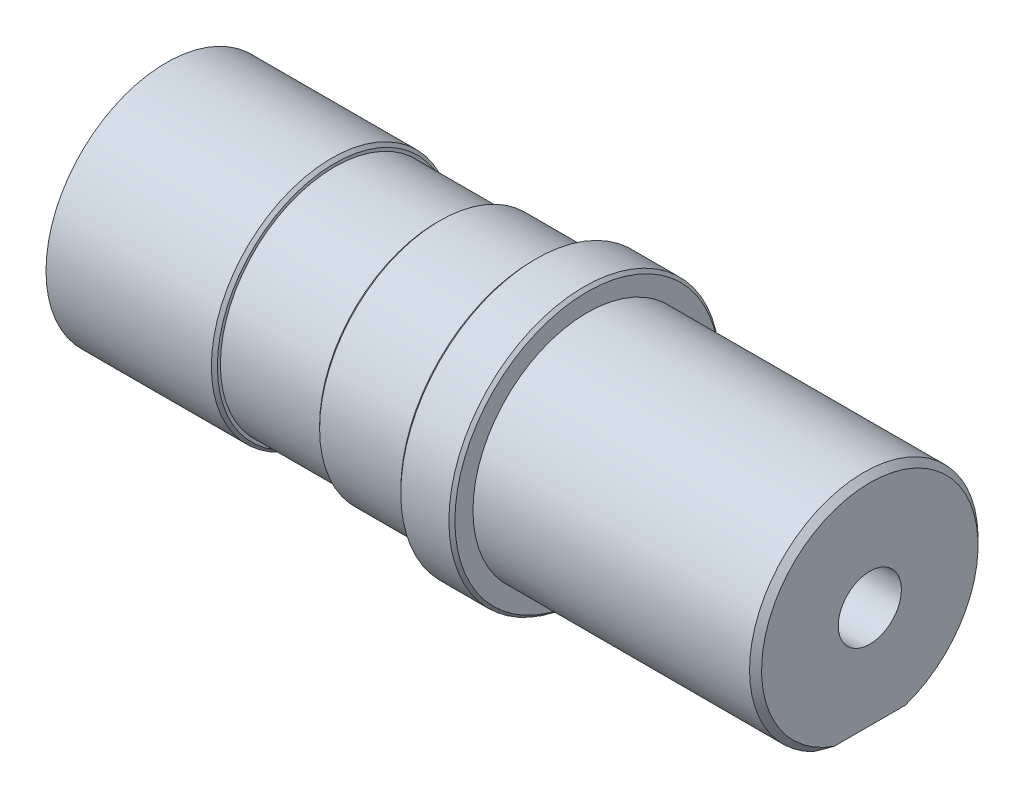
ISO-10303-21;
HEADER;
FILE_DESCRIPTION(('STEP AP214'),'2;1');
FILE_NAME('part.step','',(''),(''),'','','');
FILE_SCHEMA(('AUTOMOTIVE_DESIGN { 1 0 10303 214 1 1 1 1 }'));
ENDSEC;
DATA;
#1=APPLICATION_CONTEXT('core data for automotive mechanical design processes');
#2=APPLICATION_PROTOCOL_DEFINITION('international standard','automotive_design',2000,#1);
#3=PRODUCT_CONTEXT('',#1,'mechanical');
#4=PRODUCT('Part','Part','',(#3));
#5=PRODUCT_RELATED_PRODUCT_CATEGORY('part','',(#4));
#6=PRODUCT_DEFINITION_FORMATION('','',#4);
#7=PRODUCT_DEFINITION_CONTEXT('part definition',#1,'design');
#8=PRODUCT_DEFINITION('design','',#6,#7);
#9=PRODUCT_DEFINITION_SHAPE('','',#8);
#10=(LENGTH_UNIT() NAMED_UNIT(*) SI_UNIT(.MILLI.,.METRE.));
#11=(NAMED_UNIT(*) PLANE_ANGLE_UNIT() SI_UNIT($,.RADIAN.));
#12=(NAMED_UNIT(*) SI_UNIT($,.STERADIAN.) SOLID_ANGLE_UNIT());
#13=UNCERTAINTY_MEASURE_WITH_UNIT(LENGTH_MEASURE(1.E-05),#10,'distance_accuracy_value','');
#14=(GEOMETRIC_REPRESENTATION_CONTEXT(3) GLOBAL_UNCERTAINTY_ASSIGNED_CONTEXT((#13)) GLOBAL_UNIT_ASSIGNED_CONTEXT((#10,
#11,#12)) REPRESENTATION_CONTEXT('',''));
#15=CARTESIAN_POINT('',(0.,0.,0.));
#16=DIRECTION('',(0.,0.,1.));
#17=DIRECTION('',(1.,0.,0.));
#18=AXIS2_PLACEMENT_3D('',#15,#16,#17);
#19=CARTESIAN_POINT('',(1926.97364864528,776.790077638319,0.));
#20=DIRECTION('',(1.,0.,0.));
#21=DIRECTION('',(0.,0.,-1.));
#22=AXIS2_PLACEMENT_3D('',#19,#20,#21);
#23=PLANE('',#22);
#24=DIRECTION('',(0.,1.,0.));
#25=VECTOR('',#24,1.);
#26=CARTESIAN_POINT('',(1926.97364864528,754.790077638319,3.24999999999998));
#27=LINE('',#26,#25);
#28=CARTESIAN_POINT('',(1926.97364864528,757.055906766453,3.24999999999998));
#29=VERTEX_POINT('',#28);
#30=CARTESIAN_POINT('',(1926.97364864528,759.790077638319,3.24999999999998));
#31=VERTEX_POINT('',#30);
#32=EDGE_CURVE('E107',#29,#31,#27,.T.);
#33=ORIENTED_EDGE('',*,*,#32,.F.);
#34=CARTESIAN_POINT('',(1926.97364864528,776.790077638319,0.));
#35=DIRECTION('',(-1.,0.,0.));
#36=DIRECTION('',(0.,0.,1.));
#37=AXIS2_PLACEMENT_3D('',#34,#35,#36);
#38=CIRCLE('',#37,20.);
#39=CARTESIAN_POINT('',(1926.97364864528,757.055906766453,-3.25));
#40=VERTEX_POINT('',#39);
#41=EDGE_CURVE('E152',#29,#40,#38,.T.);
#42=ORIENTED_EDGE('',*,*,#41,.T.);
#43=DIRECTION('',(0.,1.,0.));
#44=VECTOR('',#43,1.);
#45=CARTESIAN_POINT('',(1926.97364864528,754.790077638319,-3.25));
#46=LINE('',#45,#44);
#47=CARTESIAN_POINT('',(1926.97364864528,759.790077638319,-3.25));
#48=VERTEX_POINT('',#47);
#49=EDGE_CURVE('E50',#40,#48,#46,.T.);
#50=ORIENTED_EDGE('',*,*,#49,.T.);
#51=DIRECTION('',(0.,0.,-1.));
#52=VECTOR('',#51,1.);
#53=CARTESIAN_POINT('',(1926.97364864528,759.790077638319,3.24999999999998));
#54=LINE('',#53,#52);
#55=EDGE_CURVE('E115',#31,#48,#54,.T.);
#56=ORIENTED_EDGE('',*,*,#55,.F.);
#57=EDGE_LOOP('',(#33,#42,#50,#56));
#58=FACE_BOUND('',#57,.T.);
#59=ADVANCED_FACE('F36',(#58),#23,.F.);
#60=CARTESIAN_POINT('',(1926.97364864528,776.790077638319,0.));
#61=DIRECTION('',(-1.,0.,0.));
#62=DIRECTION('',(0.,0.,1.));
#63=AXIS2_PLACEMENT_3D('',#60,#61,#62);
#64=CYLINDRICAL_SURFACE('',#63,20.);
#65=CARTESIAN_POINT('',(1954.47364864528,776.790077638319,0.));
#66=DIRECTION('',(-1.,0.,0.));
#67=DIRECTION('',(0.,0.,1.));
#68=AXIS2_PLACEMENT_3D('',#65,#66,#67);
#69=CIRCLE('',#68,20.);
#70=CARTESIAN_POINT('',(1954.47364864528,776.790077638319,20.));
#71=VERTEX_POINT('',#70);
#72=EDGE_CURVE('E202',#71,#71,#69,.T.);
#73=ORIENTED_EDGE('',*,*,#72,.T.);
#74=EDGE_LOOP('',(#73));
#75=FACE_BOUND('',#74,.T.);
#76=DIRECTION('',(-1.,0.,0.));
#77=VECTOR('',#76,1.);
#78=CARTESIAN_POINT('',(1926.97364864528,757.055906766453,3.24999999999998));
#79=LINE('',#78,#77);
#80=CARTESIAN_POINT('',(1937.97364864528,757.055906766453,3.25));
#81=VERTEX_POINT('',#80);
#82=EDGE_CURVE('E11',#81,#29,#79,.T.);
#83=ORIENTED_EDGE('',*,*,#82,.F.);
#84=CARTESIAN_POINT('',(1937.97364864528,757.055906766453,-3.25));
#85=CARTESIAN_POINT('',(1938.06441481275,757.055913037325,-3.25000945872219));
#86=CARTESIAN_POINT('',(1938.15517599691,757.055280690942,-3.24619770131109));
#87=CARTESIAN_POINT('',(1938.3360370242,757.052785151105,-3.23100506540569));
#88=CARTESIAN_POINT('',(1938.42613693092,757.050922077622,-3.21962492466821));
#89=CARTESIAN_POINT('',(1938.60493075977,757.046014506786,-3.18938761485606));
#90=CARTESIAN_POINT('',(1938.69362629063,757.042971481127,-3.17053975924724));
#91=CARTESIAN_POINT('',(1938.86907067021,757.035797540112,-3.12552916550741));
#92=CARTESIAN_POINT('',(1938.95581952197,757.03166662646,-3.09936643883743));
#93=CARTESIAN_POINT('',(1939.21227212121,757.017807191285,-3.01014945860964));
#94=CARTESIAN_POINT('',(1939.37830084984,757.00660847855,-2.93634615047358));
#95=CARTESIAN_POINT('',(1939.69553020933,756.981562591615,-2.76231918397928));
#96=CARTESIAN_POINT('',(1939.84673079893,756.967715410045,-2.66209545208773));
#97=CARTESIAN_POINT('',(1940.13152802227,756.938788039195,-2.43705653759077));
#98=CARTESIAN_POINT('',(1940.26496851086,756.923698589037,-2.3120445880453));
#99=CARTESIAN_POINT('',(1940.50908263301,756.894068017578,-2.04139626294796));
#100=CARTESIAN_POINT('',(1940.6197527795,756.879526980539,-1.89575673421848));
#101=CARTESIAN_POINT('',(1940.81576712943,756.852534403624,-1.58697401574524));
#102=CARTESIAN_POINT('',(1940.90096479106,756.840095126586,-1.42373662879656));
#103=CARTESIAN_POINT('',(1941.04266737411,756.81881227444,-1.0850415744214));
#104=CARTESIAN_POINT('',(1941.09917570788,756.80996827173,-0.909585363144951));
#105=CARTESIAN_POINT('',(1941.18142093322,756.796937439954,-0.553056745427797));
#106=CARTESIAN_POINT('',(1941.20742324734,756.792710462325,-0.372047059615593));
#107=CARTESIAN_POINT('',(1941.22874333079,756.78925204724,-0.00818361924110762));
#108=CARTESIAN_POINT('',(1941.22406235777,756.790020405037,0.174670059433256));
#109=CARTESIAN_POINT('',(1941.18435530237,756.796434415641,0.535207703755053));
#110=CARTESIAN_POINT('',(1941.14961566431,756.802034027535,0.712924152404237));
#111=CARTESIAN_POINT('',(1941.05122828072,756.817429991772,1.05997015930424));
#112=CARTESIAN_POINT('',(1940.98757987044,756.82722644062,1.22929952459578));
#113=CARTESIAN_POINT('',(1940.83289361139,756.849994123189,1.55562454519418));
#114=CARTESIAN_POINT('',(1940.74173658208,756.862979124705,1.71256270586956));
#115=CARTESIAN_POINT('',(1940.53471119419,756.890679382567,2.00901694543841));
#116=CARTESIAN_POINT('',(1940.41884186482,756.905394706876,2.14853233956013));
#117=CARTESIAN_POINT('',(1940.16410826854,756.935116937749,2.40786173718518));
#118=CARTESIAN_POINT('',(1940.02499662834,756.95012525532,2.52743268804044));
#119=CARTESIAN_POINT('',(1939.72850776648,756.978583483423,2.74160778215456));
#120=CARTESIAN_POINT('',(1939.57112533422,756.992032947194,2.83620477786171));
#121=CARTESIAN_POINT('',(1939.24226585474,757.01585307199,2.99779093011674));
#122=CARTESIAN_POINT('',(1939.07076670332,757.02621878267,3.06473576286515));
#123=CARTESIAN_POINT('',(1938.71887008117,757.042618945722,3.16870513705686));
#124=CARTESIAN_POINT('',(1938.53848635402,757.048659876332,3.20577444060292));
#125=CARTESIAN_POINT('',(1938.29289058426,757.053428433471,3.23491987525878));
#126=CARTESIAN_POINT('',(1938.2291204117,757.054356998138,3.24057732174002));
#127=CARTESIAN_POINT('',(1938.10145897284,757.055595527977,3.24811244489867));
#128=CARTESIAN_POINT('',(1938.03756809199,757.055906533473,3.24999647822751));
#129=CARTESIAN_POINT('',(1937.97364864528,757.055906766453,3.25));
#130=B_SPLINE_CURVE_WITH_KNOTS('',3,(#84,#85,#86,#87,#88,#89,#90,#91,#92,#93,#94,#95,#96,#97,
#98,#99,#100,#101,#102,#103,#104,#105,#106,#107,#108,#109,#110,#111,#112,#113,#114,#115,#116,
#117,#118,#119,#120,#121,#122,#123,#124,#125,#126,#127,#128,#129),.UNSPECIFIED.,.F.,.F.,(4,2,2,
2,2,2,2,2,2,2,2,2,2,2,2,2,2,2,2,2,2,2,4),(0.,0.272207505443017,0.544388480316941,
0.816231064003089,1.08807322176579,1.63139999429033,2.17472827901768,2.72255581729596,
3.270467188272,3.82147255509901,4.37241236913966,4.91852223134099,5.46460970984757,
6.00554985011285,6.54650242986098,7.08983316956769,7.63318525723455,8.18273928420109,
8.73245042356755,9.28303931019347,9.83280171524548,10.0247982211781,10.2164710188897),.UNSPECIFIED.);
#131=CARTESIAN_POINT('',(1937.97364864528,757.055906766453,-3.25));
#132=VERTEX_POINT('',#131);
#133=EDGE_CURVE('E43',#132,#81,#130,.T.);
#134=ORIENTED_EDGE('',*,*,#133,.F.);
#135=DIRECTION('',(-1.,0.,0.));
#136=VECTOR('',#135,1.);
#137=CARTESIAN_POINT('',(1926.97364864528,757.055906766453,-3.25));
#138=LINE('',#137,#136);
#139=EDGE_CURVE('E178',#40,#132,#138,.F.);
#140=ORIENTED_EDGE('',*,*,#139,.F.);
#141=ORIENTED_EDGE('',*,*,#41,.F.);
#142=EDGE_LOOP('',(#83,#134,#140,#141));
#143=FACE_BOUND('',#142,.T.);
#144=ADVANCED_FACE('F166',(#75,#143),#64,.T.);
#145=CARTESIAN_POINT('',(2043.97364865393,794.790077635568,0.));
#146=DIRECTION('',(-1.,0.,0.));
#147=DIRECTION('',(0.,0.,1.));
#148=AXIS2_PLACEMENT_3D('',#145,#146,#147);
#149=PLANE('',#148);
#150=CARTESIAN_POINT('',(2043.97364865393,776.790077638319,0.));
#151=DIRECTION('',(1.,0.,0.));
#152=DIRECTION('',(0.,0.,-1.));
#153=AXIS2_PLACEMENT_3D('',#150,#151,#152);
#154=CIRCLE('',#153,5.24999999999998);
#155=CARTESIAN_POINT('',(2043.97364865393,776.790077638319,-5.24999999999998));
#156=VERTEX_POINT('',#155);
#157=EDGE_CURVE('E106',#156,#156,#154,.T.);
#158=ORIENTED_EDGE('',*,*,#157,.F.);
#159=EDGE_LOOP('',(#158));
#160=FACE_BOUND('',#159,.T.);
#161=CARTESIAN_POINT('',(2043.97364865393,776.790077638319,0.));
#162=DIRECTION('',(-1.,0.,0.));
#163=DIRECTION('',(0.,0.,1.));
#164=AXIS2_PLACEMENT_3D('',#161,#162,#163);
#165=CIRCLE('',#164,17.9999999972494);
#166=CARTESIAN_POINT('',(2043.97364865393,759.790077638317,5.91607977472669));
#167=VERTEX_POINT('',#166);
#168=CARTESIAN_POINT('',(2043.97364865393,759.790077638317,-5.91607977472669));
#169=VERTEX_POINT('',#168);
#170=EDGE_CURVE('E210',#167,#169,#165,.T.);
#171=ORIENTED_EDGE('',*,*,#170,.F.);
#172=DIRECTION('',(0.,0.,1.));
#173=VECTOR('',#172,1.);
#174=CARTESIAN_POINT('',(2043.97364865393,759.790077638317,8.48528136807984));
#175=LINE('',#174,#173);
#176=EDGE_CURVE('E133',#169,#167,#175,.T.);
#177=ORIENTED_EDGE('',*,*,#176,.F.);
#178=EDGE_LOOP('',(#171,#177));
#179=FACE_BOUND('',#178,.T.);
#180=ADVANCED_FACE('F170',(#160,#179),#149,.F.);
#181=CARTESIAN_POINT('',(2043.97364865393,776.790077638319,0.));
#182=DIRECTION('',(-1.,0.,0.));
#183=DIRECTION('',(0.,0.,1.));
#184=AXIS2_PLACEMENT_3D('',#181,#182,#183);
#185=CONICAL_SURFACE('',#184,17.9999999972494,0.785398163397393);
#186=CARTESIAN_POINT('',(2042.97364865393,776.790077638319,0.));
#187=DIRECTION('',(-1.,0.,0.));
#188=DIRECTION('',(0.,0.,1.));
#189=AXIS2_PLACEMENT_3D('',#186,#187,#188);
#190=CIRCLE('',#189,18.9999999972497);
#191=CARTESIAN_POINT('',(2042.97364865393,759.790077638317,8.48528136807984));
#192=VERTEX_POINT('',#191);
#193=CARTESIAN_POINT('',(2042.97364865393,759.790077638317,-8.48528136807984));
#194=VERTEX_POINT('',#193);
#195=EDGE_CURVE('E212',#192,#194,#190,.T.);
#196=ORIENTED_EDGE('',*,*,#195,.F.);
#197=CARTESIAN_POINT('',(2036.7120728159,759.790077638317,18.6854813607021));
#198=CARTESIAN_POINT('',(2036.89178987374,759.790077638317,18.4425102643857));
#199=CARTESIAN_POINT('',(2037.0704857978,759.790077638317,18.1987845137299));
#200=CARTESIAN_POINT('',(2037.42563422349,759.790077638317,17.7096954664246));
#201=CARTESIAN_POINT('',(2037.60208667124,759.790077638317,17.4643321306651));
#202=CARTESIAN_POINT('',(2038.12787285633,759.790077638317,16.725458204696));
#203=CARTESIAN_POINT('',(2038.4735237323,759.790077638317,16.2293142172583));
#204=CARTESIAN_POINT('',(2039.15642965079,759.790077638317,15.2237677089253));
#205=CARTESIAN_POINT('',(2039.49356141063,759.790077638317,14.7142812345682));
#206=CARTESIAN_POINT('',(2040.1529097544,759.790077638317,13.6857750417211));
#207=CARTESIAN_POINT('',(2040.47512767644,759.790077638317,13.166756184361));
#208=CARTESIAN_POINT('',(2041.11684909972,759.790077638317,12.0913837298559));
#209=CARTESIAN_POINT('',(2041.43540733494,759.790077638317,11.5344626158281));
#210=CARTESIAN_POINT('',(2042.04699873224,759.790077638317,10.4065360559703));
#211=CARTESIAN_POINT('',(2042.34002697463,759.790077638317,9.83552792261777));
#212=CARTESIAN_POINT('',(2042.8925232821,759.790077638317,8.68018550234351));
#213=CARTESIAN_POINT('',(2043.15212255193,759.790077638317,8.09591460551235));
#214=CARTESIAN_POINT('',(2043.63053365351,759.790077638317,6.91110202242526));
#215=CARTESIAN_POINT('',(2043.84936899166,759.790077638317,6.31056994341095));
#216=CARTESIAN_POINT('',(2044.22470419807,759.790077638317,5.13012600938959));
#217=CARTESIAN_POINT('',(2044.38418670719,759.790077638317,4.55118274417401));
#218=CARTESIAN_POINT('',(2044.58356769461,759.790077638317,3.67372588741221));
#219=CARTESIAN_POINT('',(2044.64339587322,759.790077638317,3.37967105833904));
#220=CARTESIAN_POINT('',(2044.74882978624,759.790077638317,2.7890383907953));
#221=CARTESIAN_POINT('',(2044.79443760983,759.790077638317,2.49246092952016));
#222=CARTESIAN_POINT('',(2044.86996159467,759.790077638317,1.90266468072569));
#223=CARTESIAN_POINT('',(2044.90014209772,759.790077638317,1.60947981103941));
#224=CARTESIAN_POINT('',(2044.94547778391,759.790077638317,1.02194621055556));
#225=CARTESIAN_POINT('',(2044.96063313,759.790077638317,0.727597492415499));
#226=CARTESIAN_POINT('',(2044.97563415378,759.790077638317,0.138521970956843));
#227=CARTESIAN_POINT('',(2044.97548053319,759.790077638317,-0.156204814412682));
#228=CARTESIAN_POINT('',(2044.95986852115,759.790077638317,-0.745251576775909));
#229=CARTESIAN_POINT('',(2044.94441008084,759.790077638317,-1.03957155246803));
#230=CARTESIAN_POINT('',(2044.89852255399,759.790077638317,-1.62645351853687));
#231=CARTESIAN_POINT('',(2044.86812297007,759.790077638317,-1.91901782794284));
#232=CARTESIAN_POINT('',(2044.79291088776,759.790077638317,-2.5022784737236));
#233=CARTESIAN_POINT('',(2044.74809834637,759.790077638317,-2.79297480452465));
#234=CARTESIAN_POINT('',(2044.6448044812,759.790077638317,-3.37194024187919));
#235=CARTESIAN_POINT('',(2044.58632226133,759.790077638317,-3.66020918802816));
#236=CARTESIAN_POINT('',(2044.45658382209,759.790077638317,-4.23387254301691));
#237=CARTESIAN_POINT('',(2044.38532588753,759.790077638317,-4.5192665604484));
#238=CARTESIAN_POINT('',(2044.15116679843,759.790077638317,-5.38046765103257));
#239=CARTESIAN_POINT('',(2043.96971839888,759.790077638317,-5.95129125122629));
#240=CARTESIAN_POINT('',(2043.56648636401,759.790077638317,-7.07820067897576));
#241=CARTESIAN_POINT('',(2043.34470355821,759.790077638317,-7.63428680935619));
#242=CARTESIAN_POINT('',(2042.89756885187,759.790077638317,-8.66517846638801));
#243=CARTESIAN_POINT('',(2042.67595500958,759.790077638317,-9.1416219187723));
#244=CARTESIAN_POINT('',(2042.21193730888,759.790077638317,-10.0843271533475));
#245=CARTESIAN_POINT('',(2041.96952954812,759.790077638317,-10.5505870037086));
#246=CARTESIAN_POINT('',(2041.46726885437,759.790077638317,-11.4744106434238));
#247=CARTESIAN_POINT('',(2041.2073919663,759.790077638317,-11.9319613402627));
#248=CARTESIAN_POINT('',(2040.67348796456,759.790077638317,-12.8386557387819));
#249=CARTESIAN_POINT('',(2040.39946182544,759.790077638317,-13.2878000165645));
#250=CARTESIAN_POINT('',(2039.85242941385,759.790077638317,-14.1583065351529));
#251=CARTESIAN_POINT('',(2039.57994890888,759.790077638317,-14.5800003405353));
#252=CARTESIAN_POINT('',(2039.02592797454,759.790077638317,-15.4174063075763));
#253=CARTESIAN_POINT('',(2038.74438717146,759.790077638317,-15.8331182214729));
#254=CARTESIAN_POINT('',(2038.17473382556,759.790077638317,-16.6576399554432));
#255=CARTESIAN_POINT('',(2037.88665074026,759.790077638317,-17.0664701795595));
#256=CARTESIAN_POINT('',(2037.30398249623,759.790077638317,-17.8793778010148));
#257=CARTESIAN_POINT('',(2037.0093983622,759.790077638317,-18.2834559321973));
#258=CARTESIAN_POINT('',(2036.7120728159,759.790077638317,-18.6854813607021));
#259=B_SPLINE_CURVE_WITH_KNOTS('',3,(#197,#198,#199,#200,#201,#202,#203,#204,#205,#206,#207,
#208,#209,#210,#211,#212,#213,#214,#215,#216,#217,#218,#219,#220,#221,#222,#223,#224,#225,#226,
#227,#228,#229,#230,#231,#232,#233,#234,#235,#236,#237,#238,#239,#240,#241,#242,#243,#244,#245,
#246,#247,#248,#249,#250,#251,#252,#253,#254,#255,#256,#257,#258),.UNSPECIFIED.,.F.,.F.,(4,2,2,
2,2,2,2,2,2,2,2,2,2,2,2,2,2,2,2,2,2,2,2,2,2,2,2,2,2,2,4),(0.,0.906636447369311,1.81329462577864,
3.6271732148383,5.45975058813142,7.29216321776027,9.21640606805976,11.1410189086514,
13.0578313632266,14.9735350485127,16.7726781415209,17.672624821908,18.572439224336,
19.4562701485698,20.3400914869385,21.2238723128356,22.1076559598597,22.9897014660616,
23.8717496029128,24.7538555762334,25.6360800637716,27.4309360414662,29.2257551099255,
30.8015560565148,32.3776533808912,33.9559578971342,35.5341538512057,37.0402213530191,
38.5463510556371,40.0466850592803,41.5467842478831),.UNSPECIFIED.);
#260=EDGE_CURVE('E151',#192,#167,#259,.T.);
#261=ORIENTED_EDGE('',*,*,#260,.T.);
#262=ORIENTED_EDGE('',*,*,#170,.T.);
#263=EDGE_CURVE('E142',#169,#194,#259,.T.);
#264=ORIENTED_EDGE('',*,*,#263,.T.);
#265=EDGE_LOOP('',(#196,#261,#262,#264));
#266=FACE_BOUND('',#265,.T.);
#267=ADVANCED_FACE('F154',(#266),#185,.T.);
#268=CARTESIAN_POINT('',(1926.97364864528,776.790077638319,0.));
#269=DIRECTION('',(-1.,0.,0.));
#270=DIRECTION('',(0.,0.,1.));
#271=AXIS2_PLACEMENT_3D('',#268,#269,#270);
#272=CYLINDRICAL_SURFACE('',#271,18.9999999972497);
#273=ORIENTED_EDGE('',*,*,#195,.T.);
#274=DIRECTION('',(1.,0.,0.));
#275=VECTOR('',#274,1.);
#276=CARTESIAN_POINT('',(2002.97364865393,759.790077638317,-8.48528136807984));
#277=LINE('',#276,#275);
#278=CARTESIAN_POINT('',(2002.97364865393,759.790077638317,-8.48528136807984));
#279=VERTEX_POINT('',#278);
#280=EDGE_CURVE('E137',#279,#194,#277,.T.);
#281=ORIENTED_EDGE('',*,*,#280,.F.);
#282=CARTESIAN_POINT('',(2002.97364865393,776.790077638317,0.));
#283=DIRECTION('',(1.,0.,0.));
#284=DIRECTION('',(0.,0.,-1.));
#285=AXIS2_PLACEMENT_3D('',#282,#283,#284);
#286=CIRCLE('',#285,18.9999999972495);
#287=CARTESIAN_POINT('',(2002.97364865393,759.790077638319,8.48528136807932));
#288=VERTEX_POINT('',#287);
#289=EDGE_CURVE('E134',#288,#279,#286,.T.);
#290=ORIENTED_EDGE('',*,*,#289,.F.);
#291=DIRECTION('',(1.,0.,0.));
#292=VECTOR('',#291,1.);
#293=CARTESIAN_POINT('',(2002.97364865393,759.790077638317,8.48528136807984));
#294=LINE('',#293,#292);
#295=EDGE_CURVE('E139',#288,#192,#294,.T.);
#296=ORIENTED_EDGE('',*,*,#295,.T.);
#297=EDGE_LOOP('',(#273,#281,#290,#296));
#298=FACE_BOUND('',#297,.T.);
#299=CARTESIAN_POINT('',(1996.97364865393,776.790077638319,0.));
#300=DIRECTION('',(-1.,0.,0.));
#301=DIRECTION('',(0.,0.,1.));
#302=AXIS2_PLACEMENT_3D('',#299,#300,#301);
#303=CIRCLE('',#302,18.9999999972497);
#304=CARTESIAN_POINT('',(1996.97364865393,776.790077638319,18.9999999972497));
#305=VERTEX_POINT('',#304);
#306=EDGE_CURVE('E215',#305,#305,#303,.T.);
#307=ORIENTED_EDGE('',*,*,#306,.F.);
#308=EDGE_LOOP('',(#307));
#309=FACE_BOUND('',#308,.T.);
#310=ADVANCED_FACE('F307',(#298,#309),#272,.T.);
#311=CARTESIAN_POINT('',(1996.97364865393,798.790077631771,0.));
#312=DIRECTION('',(-1.,0.,0.));
#313=DIRECTION('',(0.,0.,1.));
#314=AXIS2_PLACEMENT_3D('',#311,#312,#313);
#315=PLANE('',#314);
#316=CARTESIAN_POINT('',(1996.97364865393,776.790077638319,0.));
#317=DIRECTION('',(-1.,0.,0.));
#318=DIRECTION('',(0.,0.,1.));
#319=AXIS2_PLACEMENT_3D('',#316,#317,#318);
#320=CIRCLE('',#319,21.9999999934516);
#321=CARTESIAN_POINT('',(1996.97364865393,776.790077638319,21.9999999934516));
#322=VERTEX_POINT('',#321);
#323=EDGE_CURVE('E220',#322,#322,#320,.T.);
#324=ORIENTED_EDGE('',*,*,#323,.F.);
#325=EDGE_LOOP('',(#324));
#326=FACE_BOUND('',#325,.T.);
#327=ORIENTED_EDGE('',*,*,#306,.T.);
#328=EDGE_LOOP('',(#327));
#329=FACE_BOUND('',#328,.T.);
#330=ADVANCED_FACE('F301',(#326,#329),#315,.F.);
#331=CARTESIAN_POINT('',(1996.97364865393,776.790077638319,0.));
#332=DIRECTION('',(-1.,0.,0.));
#333=DIRECTION('',(0.,0.,1.));
#334=AXIS2_PLACEMENT_3D('',#331,#332,#333);
#335=CONICAL_SURFACE('',#334,21.9999999934516,0.785398163397448);
#336=CARTESIAN_POINT('',(1996.47364865013,776.790077638319,0.));
#337=DIRECTION('',(-1.,0.,0.));
#338=DIRECTION('',(0.,0.,1.));
#339=AXIS2_PLACEMENT_3D('',#336,#337,#338);
#340=CIRCLE('',#339,22.4999999972496);
#341=CARTESIAN_POINT('',(1996.47364865013,776.790077638319,22.4999999972496));
#342=VERTEX_POINT('',#341);
#343=EDGE_CURVE('E223',#342,#342,#340,.T.);
#344=ORIENTED_EDGE('',*,*,#343,.F.);
#345=EDGE_LOOP('',(#344));
#346=FACE_BOUND('',#345,.T.);
#347=ORIENTED_EDGE('',*,*,#323,.T.);
#348=EDGE_LOOP('',(#347));
#349=FACE_BOUND('',#348,.T.);
#350=ADVANCED_FACE('F295',(#346,#349),#335,.T.);
#351=CARTESIAN_POINT('',(1926.97364864528,776.790077638319,0.));
#352=DIRECTION('',(-1.,0.,0.));
#353=DIRECTION('',(0.,0.,1.));
#354=AXIS2_PLACEMENT_3D('',#351,#352,#353);
#355=CYLINDRICAL_SURFACE('',#354,22.4999999972496);
#356=CARTESIAN_POINT('',(1988.47364865013,776.790077638319,0.));
#357=DIRECTION('',(-1.,0.,0.));
#358=DIRECTION('',(0.,0.,1.));
#359=AXIS2_PLACEMENT_3D('',#356,#357,#358);
#360=CIRCLE('',#359,22.4999999972496);
#361=CARTESIAN_POINT('',(1988.47364865013,776.790077638319,22.4999999972496));
#362=VERTEX_POINT('',#361);
#363=EDGE_CURVE('E226',#362,#362,#360,.T.);
#364=ORIENTED_EDGE('',*,*,#363,.F.);
#365=EDGE_LOOP('',(#364));
#366=FACE_BOUND('',#365,.T.);
#367=ORIENTED_EDGE('',*,*,#343,.T.);
#368=EDGE_LOOP('',(#367));
#369=FACE_BOUND('',#368,.T.);
#370=ADVANCED_FACE('F289',(#366,#369),#355,.T.);
#371=CARTESIAN_POINT('',(1988.47364865013,776.790077638319,0.));
#372=DIRECTION('',(1.,0.,0.));
#373=DIRECTION('',(0.,0.,-1.));
#374=AXIS2_PLACEMENT_3D('',#371,#372,#373);
#375=CONICAL_SURFACE('',#374,22.4999999972496,0.785398163397559);
#376=CARTESIAN_POINT('',(1987.97364864803,776.790077638319,0.));
#377=DIRECTION('',(-1.,0.,0.));
#378=DIRECTION('',(0.,0.,1.));
#379=AXIS2_PLACEMENT_3D('',#376,#377,#378);
#380=CIRCLE('',#379,21.9999999951506);
#381=CARTESIAN_POINT('',(1987.97364864803,776.790077638319,21.9999999951506));
#382=VERTEX_POINT('',#381);
#383=EDGE_CURVE('E229',#382,#382,#380,.T.);
#384=ORIENTED_EDGE('',*,*,#383,.F.);
#385=EDGE_LOOP('',(#384));
#386=FACE_BOUND('',#385,.T.);
#387=ORIENTED_EDGE('',*,*,#363,.T.);
#388=EDGE_LOOP('',(#387));
#389=FACE_BOUND('',#388,.T.);
#390=ADVANCED_FACE('F283',(#386,#389),#375,.T.);
#391=CARTESIAN_POINT('',(1987.97364864803,798.79007763347,0.));
#392=DIRECTION('',(1.,0.,0.));
#393=DIRECTION('',(0.,0.,-1.));
#394=AXIS2_PLACEMENT_3D('',#391,#392,#393);
#395=PLANE('',#394);
#396=CARTESIAN_POINT('',(1987.97364864803,776.790077638319,0.));
#397=DIRECTION('',(-1.,0.,0.));
#398=DIRECTION('',(0.,0.,1.));
#399=AXIS2_PLACEMENT_3D('',#396,#397,#398);
#400=CIRCLE('',#399,19.9999999972533);
#401=CARTESIAN_POINT('',(1987.97364864803,776.790077638319,19.9999999972533));
#402=VERTEX_POINT('',#401);
#403=EDGE_CURVE('E232',#402,#402,#400,.T.);
#404=ORIENTED_EDGE('',*,*,#403,.F.);
#405=EDGE_LOOP('',(#404));
#406=FACE_BOUND('',#405,.T.);
#407=ORIENTED_EDGE('',*,*,#383,.T.);
#408=EDGE_LOOP('',(#407));
#409=FACE_BOUND('',#408,.T.);
#410=ADVANCED_FACE('F277',(#406,#409),#395,.F.);
#411=CARTESIAN_POINT('',(1926.97364864528,776.790077638319,0.));
#412=DIRECTION('',(-1.,0.,0.));
#413=DIRECTION('',(0.,0.,1.));
#414=AXIS2_PLACEMENT_3D('',#411,#412,#413);
#415=CYLINDRICAL_SURFACE('',#414,19.9999999972533);
#416=CARTESIAN_POINT('',(1972.47364864524,776.790077638319,0.));
#417=DIRECTION('',(-1.,0.,0.));
#418=DIRECTION('',(0.,0.,1.));
#419=AXIS2_PLACEMENT_3D('',#416,#417,#418);
#420=CIRCLE('',#419,19.9999999972533);
#421=CARTESIAN_POINT('',(1972.47364864524,776.790077638319,19.9999999972533));
#422=VERTEX_POINT('',#421);
#423=EDGE_CURVE('E235',#422,#422,#420,.T.);
#424=ORIENTED_EDGE('',*,*,#423,.F.);
#425=EDGE_LOOP('',(#424));
#426=FACE_BOUND('',#425,.T.);
#427=ORIENTED_EDGE('',*,*,#403,.T.);
#428=EDGE_LOOP('',(#427));
#429=FACE_BOUND('',#428,.T.);
#430=ADVANCED_FACE('F271',(#426,#429),#415,.T.);
#431=CARTESIAN_POINT('',(1972.47364864524,776.790077638319,0.));
#432=DIRECTION('',(1.,0.,0.));
#433=DIRECTION('',(0.,0.,-1.));
#434=AXIS2_PLACEMENT_3D('',#431,#432,#433);
#435=CONICAL_SURFACE('',#434,19.9999999972533,0.785398163397448);
#436=CARTESIAN_POINT('',(1971.97364864528,776.790077638319,0.));
#437=DIRECTION('',(-1.,0.,0.));
#438=DIRECTION('',(0.,0.,1.));
#439=AXIS2_PLACEMENT_3D('',#436,#437,#438);
#440=CIRCLE('',#439,19.4999999973007);
#441=CARTESIAN_POINT('',(1971.97364864528,776.790077638319,19.4999999973007));
#442=VERTEX_POINT('',#441);
#443=EDGE_CURVE('E238',#442,#442,#440,.T.);
#444=ORIENTED_EDGE('',*,*,#443,.F.);
#445=EDGE_LOOP('',(#444));
#446=FACE_BOUND('',#445,.T.);
#447=ORIENTED_EDGE('',*,*,#423,.T.);
#448=EDGE_LOOP('',(#447));
#449=FACE_BOUND('',#448,.T.);
#450=ADVANCED_FACE('F265',(#446,#449),#435,.T.);
#451=CARTESIAN_POINT('',(1971.97364864528,796.29007763562,0.));
#452=DIRECTION('',(1.,0.,0.));
#453=DIRECTION('',(0.,0.,-1.));
#454=AXIS2_PLACEMENT_3D('',#451,#452,#453);
#455=PLANE('',#454);
#456=CARTESIAN_POINT('',(1971.97364864528,776.790077638319,0.));
#457=DIRECTION('',(-1.,0.,0.));
#458=DIRECTION('',(0.,0.,1.));
#459=AXIS2_PLACEMENT_3D('',#456,#457,#458);
#460=CIRCLE('',#459,19.);
#461=CARTESIAN_POINT('',(1971.97364864528,776.790077638319,19.));
#462=VERTEX_POINT('',#461);
#463=EDGE_CURVE('E241',#462,#462,#460,.T.);
#464=ORIENTED_EDGE('',*,*,#463,.F.);
#465=EDGE_LOOP('',(#464));
#466=FACE_BOUND('',#465,.T.);
#467=ORIENTED_EDGE('',*,*,#443,.T.);
#468=EDGE_LOOP('',(#467));
#469=FACE_BOUND('',#468,.T.);
#470=ADVANCED_FACE('F259',(#466,#469),#455,.F.);
#471=CARTESIAN_POINT('',(1926.97364864528,776.790077638319,0.));
#472=DIRECTION('',(-1.,0.,0.));
#473=DIRECTION('',(0.,0.,1.));
#474=AXIS2_PLACEMENT_3D('',#471,#472,#473);
#475=CYLINDRICAL_SURFACE('',#474,19.);
#476=CARTESIAN_POINT('',(1954.97364864528,776.790077638319,0.));
#477=DIRECTION('',(-1.,0.,0.));
#478=DIRECTION('',(0.,0.,1.));
#479=AXIS2_PLACEMENT_3D('',#476,#477,#478);
#480=CIRCLE('',#479,19.);
#481=CARTESIAN_POINT('',(1954.97364864528,776.790077638319,19.));
#482=VERTEX_POINT('',#481);
#483=EDGE_CURVE('E244',#482,#482,#480,.T.);
#484=ORIENTED_EDGE('',*,*,#483,.F.);
#485=EDGE_LOOP('',(#484));
#486=FACE_BOUND('',#485,.T.);
#487=ORIENTED_EDGE('',*,*,#463,.T.);
#488=EDGE_LOOP('',(#487));
#489=FACE_BOUND('',#488,.T.);
#490=ADVANCED_FACE('F254',(#486,#489),#475,.T.);
#491=CARTESIAN_POINT('',(1954.97364864528,796.290077638319,0.));
#492=DIRECTION('',(-1.,0.,0.));
#493=DIRECTION('',(0.,0.,1.));
#494=AXIS2_PLACEMENT_3D('',#491,#492,#493);
#495=PLANE('',#494);
#496=CARTESIAN_POINT('',(1954.97364864528,776.790077638319,0.));
#497=DIRECTION('',(-1.,0.,0.));
#498=DIRECTION('',(0.,0.,1.));
#499=AXIS2_PLACEMENT_3D('',#496,#497,#498);
#500=CIRCLE('',#499,19.5);
#501=CARTESIAN_POINT('',(1954.97364864528,776.790077638319,19.5));
#502=VERTEX_POINT('',#501);
#503=EDGE_CURVE('E204',#502,#502,#500,.T.);
#504=ORIENTED_EDGE('',*,*,#503,.F.);
#505=EDGE_LOOP('',(#504));
#506=FACE_BOUND('',#505,.T.);
#507=ORIENTED_EDGE('',*,*,#483,.T.);
#508=EDGE_LOOP('',(#507));
#509=FACE_BOUND('',#508,.T.);
#510=ADVANCED_FACE('F251',(#506,#509),#495,.F.);
#511=CARTESIAN_POINT('',(1954.97364864528,776.790077638319,0.));
#512=DIRECTION('',(-1.,0.,0.));
#513=DIRECTION('',(0.,0.,1.));
#514=AXIS2_PLACEMENT_3D('',#511,#512,#513);
#515=CONICAL_SURFACE('',#514,19.5,0.785398163397337);
#516=ORIENTED_EDGE('',*,*,#72,.F.);
#517=EDGE_LOOP('',(#516));
#518=FACE_BOUND('',#517,.T.);
#519=ORIENTED_EDGE('',*,*,#503,.T.);
#520=EDGE_LOOP('',(#519));
#521=FACE_BOUND('',#520,.T.);
#522=ADVANCED_FACE('F163',(#518,#521),#515,.T.);
#523=CARTESIAN_POINT('',(2002.97364865393,759.790077638317,8.48528136807984));
#524=DIRECTION('',(0.,1.,0.));
#525=DIRECTION('',(0.,0.,1.));
#526=AXIS2_PLACEMENT_3D('',#523,#524,#525);
#527=PLANE('',#526);
#528=ORIENTED_EDGE('',*,*,#295,.F.);
#529=DIRECTION('',(0.,0.,1.));
#530=VECTOR('',#529,1.);
#531=CARTESIAN_POINT('',(2002.97364865393,759.790077638317,8.48528136807984));
#532=LINE('',#531,#530);
#533=EDGE_CURVE('E57',#279,#288,#532,.T.);
#534=ORIENTED_EDGE('',*,*,#533,.F.);
#535=ORIENTED_EDGE('',*,*,#280,.T.);
#536=ORIENTED_EDGE('',*,*,#263,.F.);
#537=ORIENTED_EDGE('',*,*,#176,.T.);
#538=ORIENTED_EDGE('',*,*,#260,.F.);
#539=EDGE_LOOP('',(#528,#534,#535,#536,#537,#538));
#540=FACE_BOUND('',#539,.T.);
#541=ADVANCED_FACE('F157',(#540),#527,.F.);
#542=CARTESIAN_POINT('',(2002.97364865393,776.790077638317,0.));
#543=DIRECTION('',(1.,0.,0.));
#544=DIRECTION('',(0.,0.,-1.));
#545=AXIS2_PLACEMENT_3D('',#542,#543,#544);
#546=PLANE('',#545);
#547=ORIENTED_EDGE('',*,*,#289,.T.);
#548=ORIENTED_EDGE('',*,*,#533,.T.);
#549=EDGE_LOOP('',(#547,#548));
#550=FACE_BOUND('',#549,.T.);
#551=ADVANCED_FACE('F162',(#550),#546,.T.);
#552=CARTESIAN_POINT('',(2015.47364865393,776.790077638319,0.));
#553=DIRECTION('',(1.,0.,0.));
#554=DIRECTION('',(0.,0.,-1.));
#555=AXIS2_PLACEMENT_3D('',#552,#553,#554);
#556=CONICAL_SURFACE('',#555,5.24999999999998,1.02974425867669);
#557=CARTESIAN_POINT('',(2012.31913040403,776.790077638319,0.));
#558=VERTEX_POINT('',#557);
#559=VERTEX_LOOP('',#558);
#560=FACE_BOUND('',#559,.T.);
#561=CARTESIAN_POINT('',(2015.47364865393,776.790077638319,0.));
#562=DIRECTION('',(1.,0.,0.));
#563=DIRECTION('',(0.,0.,-1.));
#564=AXIS2_PLACEMENT_3D('',#561,#562,#563);
#565=CIRCLE('',#564,5.24999999999998);
#566=CARTESIAN_POINT('',(2015.47364865393,776.790077638319,-5.24999999999998));
#567=VERTEX_POINT('',#566);
#568=EDGE_CURVE('E130',#567,#567,#565,.T.);
#569=ORIENTED_EDGE('',*,*,#568,.T.);
#570=EDGE_LOOP('',(#569));
#571=FACE_BOUND('',#570,.T.);
#572=ADVANCED_FACE('F187',(#560,#571),#556,.F.);
#573=CARTESIAN_POINT('',(2043.97364865393,776.790077638319,0.));
#574=DIRECTION('',(1.,0.,0.));
#575=DIRECTION('',(0.,0.,-1.));
#576=AXIS2_PLACEMENT_3D('',#573,#574,#575);
#577=CYLINDRICAL_SURFACE('',#576,5.24999999999998);
#578=ORIENTED_EDGE('',*,*,#568,.F.);
#579=EDGE_LOOP('',(#578));
#580=FACE_BOUND('',#579,.T.);
#581=ORIENTED_EDGE('',*,*,#157,.T.);
#582=EDGE_LOOP('',(#581));
#583=FACE_BOUND('',#582,.T.);
#584=ADVANCED_FACE('F184',(#580,#583),#577,.F.);
#585=CARTESIAN_POINT('',(1937.97364864528,754.790077638319,0.));
#586=DIRECTION('',(0.,1.,0.));
#587=DIRECTION('',(-1.,0.,0.));
#588=AXIS2_PLACEMENT_3D('',#585,#586,#587);
#589=CYLINDRICAL_SURFACE('',#588,3.25);
#590=ORIENTED_EDGE('',*,*,#133,.T.);
#591=DIRECTION('',(0.,1.,0.));
#592=VECTOR('',#591,1.);
#593=CARTESIAN_POINT('',(1937.97364864528,754.790077638319,3.25));
#594=LINE('',#593,#592);
#595=CARTESIAN_POINT('',(1937.97364864528,759.790077638319,3.25));
#596=VERTEX_POINT('',#595);
#597=EDGE_CURVE('E97',#81,#596,#594,.T.);
#598=ORIENTED_EDGE('',*,*,#597,.T.);
#599=CARTESIAN_POINT('',(1937.97364864528,759.790077638319,0.));
#600=DIRECTION('',(0.,-1.,0.));
#601=DIRECTION('',(1.,0.,0.));
#602=AXIS2_PLACEMENT_3D('',#599,#600,#601);
#603=CIRCLE('',#602,3.25);
#604=CARTESIAN_POINT('',(1937.97364864528,759.790077638319,-3.25));
#605=VERTEX_POINT('',#604);
#606=EDGE_CURVE('E102',#605,#596,#603,.T.);
#607=ORIENTED_EDGE('',*,*,#606,.F.);
#608=DIRECTION('',(0.,1.,0.));
#609=VECTOR('',#608,1.);
#610=CARTESIAN_POINT('',(1937.97364864528,754.790077638319,-3.25));
#611=LINE('',#610,#609);
#612=EDGE_CURVE('E124',#132,#605,#611,.T.);
#613=ORIENTED_EDGE('',*,*,#612,.F.);
#614=EDGE_LOOP('',(#590,#598,#607,#613));
#615=FACE_BOUND('',#614,.T.);
#616=ADVANCED_FACE('F99',(#615),#589,.F.);
#617=CARTESIAN_POINT('',(1937.97364864528,754.790077638319,3.25));
#618=DIRECTION('',(0.,0.,-1.));
#619=DIRECTION('',(-1.,0.,0.));
#620=AXIS2_PLACEMENT_3D('',#617,#618,#619);
#621=PLANE('',#620);
#622=ORIENTED_EDGE('',*,*,#82,.T.);
#623=ORIENTED_EDGE('',*,*,#32,.T.);
#624=DIRECTION('',(-1.,0.,0.));
#625=VECTOR('',#624,1.);
#626=CARTESIAN_POINT('',(1937.97364864528,759.790077638319,3.25));
#627=LINE('',#626,#625);
#628=EDGE_CURVE('E110',#596,#31,#627,.T.);
#629=ORIENTED_EDGE('',*,*,#628,.F.);
#630=ORIENTED_EDGE('',*,*,#597,.F.);
#631=EDGE_LOOP('',(#622,#623,#629,#630));
#632=FACE_BOUND('',#631,.T.);
#633=ADVANCED_FACE('F111',(#632),#621,.T.);
#634=CARTESIAN_POINT('',(1937.97364864528,754.790077638319,-3.25));
#635=DIRECTION('',(0.,0.,1.));
#636=DIRECTION('',(1.,0.,0.));
#637=AXIS2_PLACEMENT_3D('',#634,#635,#636);
#638=PLANE('',#637);
#639=ORIENTED_EDGE('',*,*,#139,.T.);
#640=ORIENTED_EDGE('',*,*,#612,.T.);
#641=DIRECTION('',(1.,0.,0.));
#642=VECTOR('',#641,1.);
#643=CARTESIAN_POINT('',(1937.97364864528,759.790077638319,-3.25));
#644=LINE('',#643,#642);
#645=EDGE_CURVE('E119',#48,#605,#644,.T.);
#646=ORIENTED_EDGE('',*,*,#645,.F.);
#647=ORIENTED_EDGE('',*,*,#49,.F.);
#648=EDGE_LOOP('',(#639,#640,#646,#647));
#649=FACE_BOUND('',#648,.T.);
#650=ADVANCED_FACE('F350',(#649),#638,.T.);
#651=CARTESIAN_POINT('',(1937.97364864528,759.790077638319,0.));
#652=DIRECTION('',(0.,-1.,0.));
#653=DIRECTION('',(1.,0.,0.));
#654=AXIS2_PLACEMENT_3D('',#651,#652,#653);
#655=PLANE('',#654);
#656=ORIENTED_EDGE('',*,*,#606,.T.);
#657=ORIENTED_EDGE('',*,*,#628,.T.);
#658=ORIENTED_EDGE('',*,*,#55,.T.);
#659=ORIENTED_EDGE('',*,*,#645,.T.);
#660=EDGE_LOOP('',(#656,#657,#658,#659));
#661=FACE_BOUND('',#660,.T.);
#662=ADVANCED_FACE('F118',(#661),#655,.T.);
#663=CLOSED_SHELL('',(#59,#144,#180,#267,#310,#330,#350,#370,#390,#410,#430,#450,#470,#490,#510,
#522,#541,#551,#572,#584,#616,#633,#650,#662));
#664=MANIFOLD_SOLID_BREP('B2',#663);
#665=ADVANCED_BREP_SHAPE_REPRESENTATION('',(#18,#664),#14);
#666=SHAPE_DEFINITION_REPRESENTATION(#9,#665);
ENDSEC;
END-ISO-10303-21;
